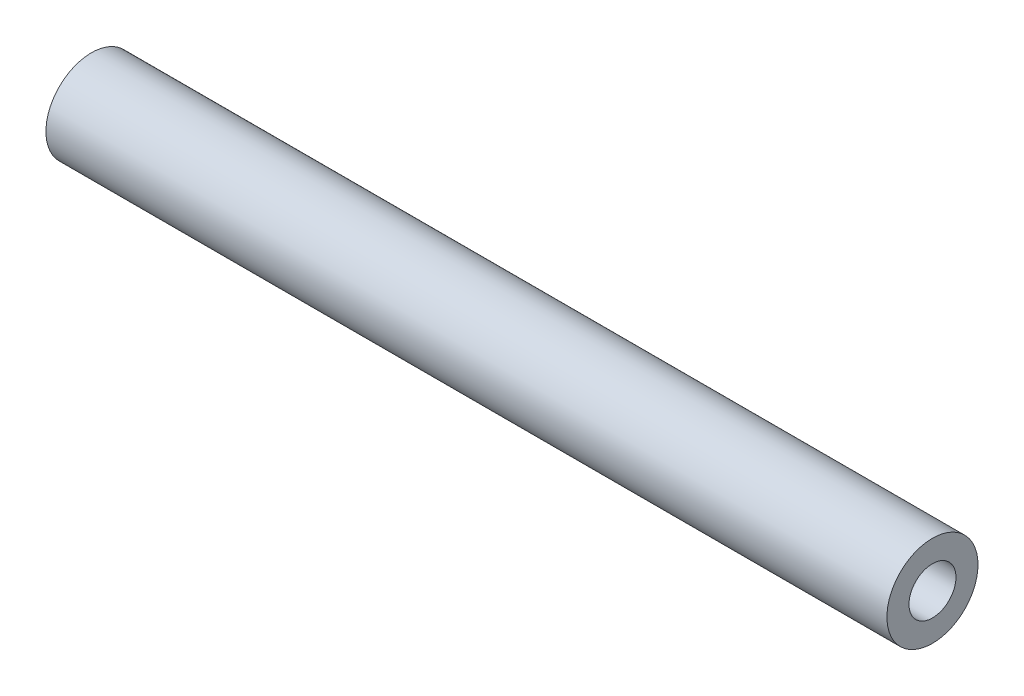
ISO-10303-21;
HEADER;
FILE_DESCRIPTION(('STEP AP214'),'2;1');
FILE_NAME('part.step','',(''),(''),'','','');
FILE_SCHEMA(('AUTOMOTIVE_DESIGN { 1 0 10303 214 1 1 1 1 }'));
ENDSEC;
DATA;
#1=APPLICATION_CONTEXT('core data for automotive mechanical design processes');
#2=APPLICATION_PROTOCOL_DEFINITION('international standard','automotive_design',2000,#1);
#3=PRODUCT_CONTEXT('',#1,'mechanical');
#4=PRODUCT('Part','Part','',(#3));
#5=PRODUCT_RELATED_PRODUCT_CATEGORY('part','',(#4));
#6=PRODUCT_DEFINITION_FORMATION('','',#4);
#7=PRODUCT_DEFINITION_CONTEXT('part definition',#1,'design');
#8=PRODUCT_DEFINITION('design','',#6,#7);
#9=PRODUCT_DEFINITION_SHAPE('','',#8);
#10=(LENGTH_UNIT() NAMED_UNIT(*) SI_UNIT(.MILLI.,.METRE.));
#11=(NAMED_UNIT(*) PLANE_ANGLE_UNIT() SI_UNIT($,.RADIAN.));
#12=(NAMED_UNIT(*) SI_UNIT($,.STERADIAN.) SOLID_ANGLE_UNIT());
#13=UNCERTAINTY_MEASURE_WITH_UNIT(LENGTH_MEASURE(1.E-05),#10,'distance_accuracy_value','');
#14=(GEOMETRIC_REPRESENTATION_CONTEXT(3) GLOBAL_UNCERTAINTY_ASSIGNED_CONTEXT((#13)) GLOBAL_UNIT_ASSIGNED_CONTEXT((#10,
#11,#12)) REPRESENTATION_CONTEXT('',''));
#15=CARTESIAN_POINT('',(0.,0.,0.));
#16=DIRECTION('',(0.,0.,1.));
#17=DIRECTION('',(1.,0.,0.));
#18=AXIS2_PLACEMENT_3D('',#15,#16,#17);
#19=CARTESIAN_POINT('',(-151.646208540298,0.,1.80477854883065E-13));
#20=DIRECTION('',(1.,0.,0.));
#21=DIRECTION('',(0.,0.,-1.));
#22=AXIS2_PLACEMENT_3D('',#19,#20,#21);
#23=CYLINDRICAL_SURFACE('',#22,4.79308085921316);
#24=CARTESIAN_POINT('',(19.9197652092532,0.,-1.72378474271034E-13));
#25=DIRECTION('',(1.,0.,0.));
#26=DIRECTION('',(0.,0.,-1.));
#27=AXIS2_PLACEMENT_3D('',#24,#25,#26);
#28=CIRCLE('',#27,4.79308085921316);
#29=CARTESIAN_POINT('',(19.9197652092532,0.,-4.79308085921333));
#30=VERTEX_POINT('',#29);
#31=EDGE_CURVE('E26',#30,#30,#28,.F.);
#32=ORIENTED_EDGE('',*,*,#31,.F.);
#33=EDGE_LOOP('',(#32));
#34=FACE_BOUND('',#33,.T.);
#35=CARTESIAN_POINT('',(-151.646208540298,0.,1.80477854883065E-13));
#36=DIRECTION('',(1.,0.,0.));
#37=DIRECTION('',(0.,0.,-1.));
#38=AXIS2_PLACEMENT_3D('',#35,#36,#37);
#39=CIRCLE('',#38,4.79308085921316);
#40=CARTESIAN_POINT('',(-151.646208540298,0.,-4.79308085921298));
#41=VERTEX_POINT('',#40);
#42=EDGE_CURVE('E17',#41,#41,#39,.F.);
#43=ORIENTED_EDGE('',*,*,#42,.T.);
#44=EDGE_LOOP('',(#43));
#45=FACE_BOUND('',#44,.T.);
#46=ADVANCED_FACE('F14',(#34,#45),#23,.F.);
#47=CARTESIAN_POINT('',(-151.646208540298,0.,1.80477854883065E-13));
#48=DIRECTION('',(1.,0.,0.));
#49=DIRECTION('',(0.,0.,-1.));
#50=AXIS2_PLACEMENT_3D('',#47,#48,#49);
#51=PLANE('',#50);
#52=CARTESIAN_POINT('',(-151.646208540298,0.,1.80477854883065E-13));
#53=DIRECTION('',(1.,0.,0.));
#54=DIRECTION('',(0.,0.,-1.));
#55=AXIS2_PLACEMENT_3D('',#52,#53,#54);
#56=CIRCLE('',#55,9.29122460626894);
#57=CARTESIAN_POINT('',(-151.646208540298,0.,-9.29122460626876));
#58=VERTEX_POINT('',#57);
#59=EDGE_CURVE('E21',#58,#58,#56,.T.);
#60=ORIENTED_EDGE('',*,*,#59,.F.);
#61=EDGE_LOOP('',(#60));
#62=FACE_BOUND('',#61,.T.);
#63=ORIENTED_EDGE('',*,*,#42,.F.);
#64=EDGE_LOOP('',(#63));
#65=FACE_BOUND('',#64,.T.);
#66=ADVANCED_FACE('F35',(#62,#65),#51,.F.);
#67=CARTESIAN_POINT('',(19.9197652092532,0.,1.80477854883065E-13));
#68=DIRECTION('',(1.,0.,0.));
#69=DIRECTION('',(0.,0.,-1.));
#70=AXIS2_PLACEMENT_3D('',#67,#68,#69);
#71=PLANE('',#70);
#72=CARTESIAN_POINT('',(19.9197652092532,0.,1.88577235495097E-13));
#73=DIRECTION('',(1.,0.,0.));
#74=DIRECTION('',(0.,0.,-1.));
#75=AXIS2_PLACEMENT_3D('',#72,#73,#74);
#76=CIRCLE('',#75,9.29122460626894);
#77=CARTESIAN_POINT('',(19.9197652092532,0.,-9.29122460626875));
#78=VERTEX_POINT('',#77);
#79=EDGE_CURVE('E9',#78,#78,#76,.F.);
#80=ORIENTED_EDGE('',*,*,#79,.F.);
#81=EDGE_LOOP('',(#80));
#82=FACE_BOUND('',#81,.T.);
#83=ORIENTED_EDGE('',*,*,#31,.T.);
#84=EDGE_LOOP('',(#83));
#85=FACE_BOUND('',#84,.T.);
#86=ADVANCED_FACE('F37',(#82,#85),#71,.T.);
#87=CARTESIAN_POINT('',(-151.646208540298,0.,1.80477854883065E-13));
#88=DIRECTION('',(1.,0.,0.));
#89=DIRECTION('',(0.,0.,-1.));
#90=AXIS2_PLACEMENT_3D('',#87,#88,#89);
#91=CYLINDRICAL_SURFACE('',#90,9.29122460626894);
#92=ORIENTED_EDGE('',*,*,#59,.T.);
#93=EDGE_LOOP('',(#92));
#94=FACE_BOUND('',#93,.T.);
#95=ORIENTED_EDGE('',*,*,#79,.T.);
#96=EDGE_LOOP('',(#95));
#97=FACE_BOUND('',#96,.T.);
#98=ADVANCED_FACE('F44',(#94,#97),#91,.T.);
#99=CLOSED_SHELL('',(#46,#66,#86,#98));
#100=MANIFOLD_SOLID_BREP('B1',#99);
#101=ADVANCED_BREP_SHAPE_REPRESENTATION('',(#18,#100),#14);
#102=SHAPE_DEFINITION_REPRESENTATION(#9,#101);
ENDSEC;
END-ISO-10303-21;
